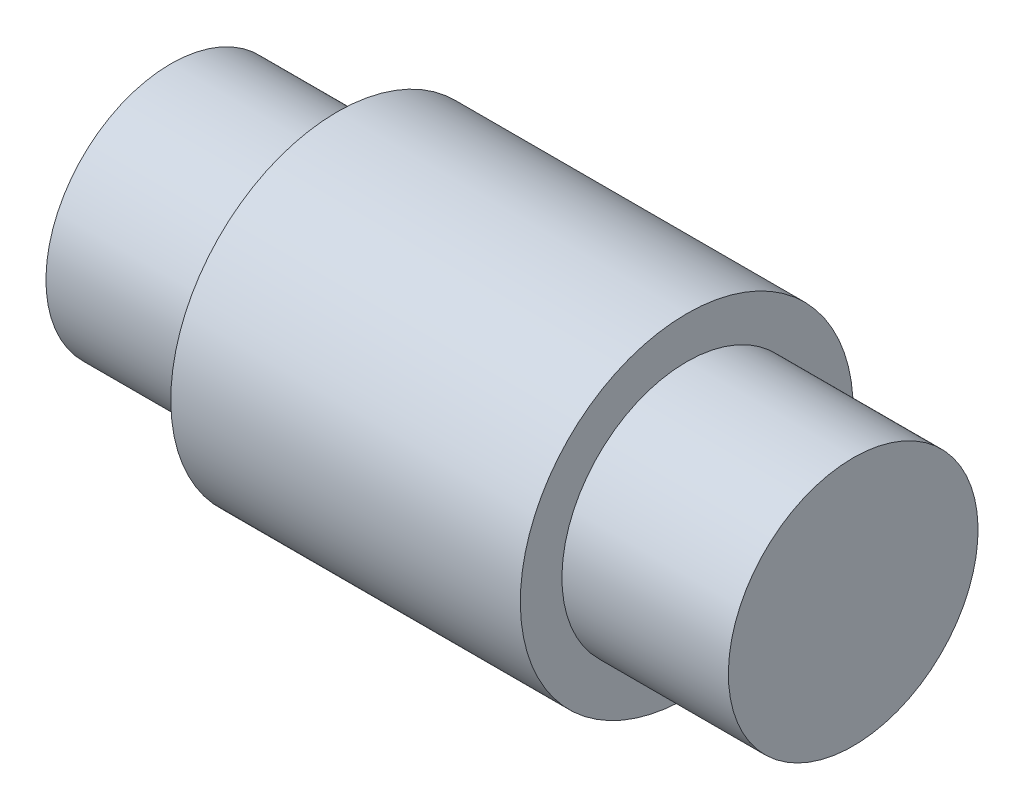
ISO-10303-21;
HEADER;
FILE_DESCRIPTION(('STEP AP214'),'2;1');
FILE_NAME('part.step','',(''),(''),'','','');
FILE_SCHEMA(('AUTOMOTIVE_DESIGN { 1 0 10303 214 1 1 1 1 }'));
ENDSEC;
DATA;
#1=APPLICATION_CONTEXT('core data for automotive mechanical design processes');
#2=APPLICATION_PROTOCOL_DEFINITION('international standard','automotive_design',2000,#1);
#3=PRODUCT_CONTEXT('',#1,'mechanical');
#4=PRODUCT('Part','Part','',(#3));
#5=PRODUCT_RELATED_PRODUCT_CATEGORY('part','',(#4));
#6=PRODUCT_DEFINITION_FORMATION('','',#4);
#7=PRODUCT_DEFINITION_CONTEXT('part definition',#1,'design');
#8=PRODUCT_DEFINITION('design','',#6,#7);
#9=PRODUCT_DEFINITION_SHAPE('','',#8);
#10=(LENGTH_UNIT() NAMED_UNIT(*) SI_UNIT(.MILLI.,.METRE.));
#11=(NAMED_UNIT(*) PLANE_ANGLE_UNIT() SI_UNIT($,.RADIAN.));
#12=(NAMED_UNIT(*) SI_UNIT($,.STERADIAN.) SOLID_ANGLE_UNIT());
#13=UNCERTAINTY_MEASURE_WITH_UNIT(LENGTH_MEASURE(1.E-05),#10,'distance_accuracy_value','');
#14=(GEOMETRIC_REPRESENTATION_CONTEXT(3) GLOBAL_UNCERTAINTY_ASSIGNED_CONTEXT((#13)) GLOBAL_UNIT_ASSIGNED_CONTEXT((#10,
#11,#12)) REPRESENTATION_CONTEXT('',''));
#15=CARTESIAN_POINT('',(0.,0.,0.));
#16=DIRECTION('',(0.,0.,1.));
#17=DIRECTION('',(1.,0.,0.));
#18=AXIS2_PLACEMENT_3D('',#15,#16,#17);
#19=CARTESIAN_POINT('',(0.,-3.,0.));
#20=DIRECTION('',(-1.,0.,0.));
#21=DIRECTION('',(0.,-1.,0.));
#22=AXIS2_PLACEMENT_3D('',#19,#20,#21);
#23=PLANE('',#22);
#24=CARTESIAN_POINT('',(0.,-3.,0.));
#25=DIRECTION('',(1.,0.,0.));
#26=DIRECTION('',(0.,1.,0.));
#27=AXIS2_PLACEMENT_3D('',#24,#25,#26);
#28=CIRCLE('',#27,3.);
#29=CARTESIAN_POINT('',(0.,0.,0.));
#30=VERTEX_POINT('',#29);
#31=EDGE_CURVE('E10',#30,#30,#28,.T.);
#32=ORIENTED_EDGE('',*,*,#31,.F.);
#33=EDGE_LOOP('',(#32));
#34=FACE_BOUND('',#33,.T.);
#35=ADVANCED_FACE('F15',(#34),#23,.T.);
#36=CARTESIAN_POINT('',(16.4,-3.,0.));
#37=DIRECTION('',(1.,0.,0.));
#38=DIRECTION('',(0.,1.,0.));
#39=AXIS2_PLACEMENT_3D('',#36,#37,#38);
#40=CYLINDRICAL_SURFACE('',#39,3.);
#41=ORIENTED_EDGE('',*,*,#31,.T.);
#42=EDGE_LOOP('',(#41));
#43=FACE_BOUND('',#42,.T.);
#44=CARTESIAN_POINT('',(4.,-3.,0.));
#45=DIRECTION('',(1.,0.,0.));
#46=DIRECTION('',(0.,1.,0.));
#47=AXIS2_PLACEMENT_3D('',#44,#45,#46);
#48=CIRCLE('',#47,3.);
#49=CARTESIAN_POINT('',(4.,0.,0.));
#50=VERTEX_POINT('',#49);
#51=EDGE_CURVE('E21',#50,#50,#48,.T.);
#52=ORIENTED_EDGE('',*,*,#51,.F.);
#53=EDGE_LOOP('',(#52));
#54=FACE_BOUND('',#53,.T.);
#55=ADVANCED_FACE('F59',(#43,#54),#40,.T.);
#56=CARTESIAN_POINT('',(4.,0.,0.));
#57=DIRECTION('',(-1.,0.,0.));
#58=DIRECTION('',(0.,-1.,0.));
#59=AXIS2_PLACEMENT_3D('',#56,#57,#58);
#60=PLANE('',#59);
#61=ORIENTED_EDGE('',*,*,#51,.T.);
#62=EDGE_LOOP('',(#61));
#63=FACE_BOUND('',#62,.T.);
#64=CARTESIAN_POINT('',(4.,-3.,0.));
#65=DIRECTION('',(1.,0.,0.));
#66=DIRECTION('',(0.,1.,0.));
#67=AXIS2_PLACEMENT_3D('',#64,#65,#66);
#68=CIRCLE('',#67,4.);
#69=CARTESIAN_POINT('',(4.,1.,0.));
#70=VERTEX_POINT('',#69);
#71=EDGE_CURVE('E25',#70,#70,#68,.T.);
#72=ORIENTED_EDGE('',*,*,#71,.F.);
#73=EDGE_LOOP('',(#72));
#74=FACE_BOUND('',#73,.T.);
#75=ADVANCED_FACE('F65',(#63,#74),#60,.T.);
#76=CARTESIAN_POINT('',(16.4,-3.,0.));
#77=DIRECTION('',(1.,0.,0.));
#78=DIRECTION('',(0.,1.,0.));
#79=AXIS2_PLACEMENT_3D('',#76,#77,#78);
#80=CYLINDRICAL_SURFACE('',#79,4.);
#81=ORIENTED_EDGE('',*,*,#71,.T.);
#82=EDGE_LOOP('',(#81));
#83=FACE_BOUND('',#82,.T.);
#84=CARTESIAN_POINT('',(12.4,-3.,0.));
#85=DIRECTION('',(1.,0.,0.));
#86=DIRECTION('',(0.,1.,0.));
#87=AXIS2_PLACEMENT_3D('',#84,#85,#86);
#88=CIRCLE('',#87,4.);
#89=CARTESIAN_POINT('',(12.4,1.,0.));
#90=VERTEX_POINT('',#89);
#91=EDGE_CURVE('E29',#90,#90,#88,.T.);
#92=ORIENTED_EDGE('',*,*,#91,.F.);
#93=EDGE_LOOP('',(#92));
#94=FACE_BOUND('',#93,.T.);
#95=ADVANCED_FACE('F55',(#83,#94),#80,.T.);
#96=CARTESIAN_POINT('',(12.4,1.,0.));
#97=DIRECTION('',(1.,0.,0.));
#98=DIRECTION('',(0.,1.,0.));
#99=AXIS2_PLACEMENT_3D('',#96,#97,#98);
#100=PLANE('',#99);
#101=ORIENTED_EDGE('',*,*,#91,.T.);
#102=EDGE_LOOP('',(#101));
#103=FACE_BOUND('',#102,.T.);
#104=CARTESIAN_POINT('',(12.4,-3.,0.));
#105=DIRECTION('',(1.,0.,0.));
#106=DIRECTION('',(0.,1.,0.));
#107=AXIS2_PLACEMENT_3D('',#104,#105,#106);
#108=CIRCLE('',#107,3.);
#109=CARTESIAN_POINT('',(12.4,0.,0.));
#110=VERTEX_POINT('',#109);
#111=EDGE_CURVE('E34',#110,#110,#108,.T.);
#112=ORIENTED_EDGE('',*,*,#111,.F.);
#113=EDGE_LOOP('',(#112));
#114=FACE_BOUND('',#113,.T.);
#115=ADVANCED_FACE('F45',(#103,#114),#100,.T.);
#116=CARTESIAN_POINT('',(16.4,-3.,0.));
#117=DIRECTION('',(1.,0.,0.));
#118=DIRECTION('',(0.,1.,0.));
#119=AXIS2_PLACEMENT_3D('',#116,#117,#118);
#120=CYLINDRICAL_SURFACE('',#119,3.);
#121=ORIENTED_EDGE('',*,*,#111,.T.);
#122=EDGE_LOOP('',(#121));
#123=FACE_BOUND('',#122,.T.);
#124=CARTESIAN_POINT('',(16.4,-3.,0.));
#125=DIRECTION('',(1.,0.,0.));
#126=DIRECTION('',(0.,1.,0.));
#127=AXIS2_PLACEMENT_3D('',#124,#125,#126);
#128=CIRCLE('',#127,3.);
#129=CARTESIAN_POINT('',(16.4,0.,0.));
#130=VERTEX_POINT('',#129);
#131=EDGE_CURVE('E37',#130,#130,#128,.T.);
#132=ORIENTED_EDGE('',*,*,#131,.F.);
#133=EDGE_LOOP('',(#132));
#134=FACE_BOUND('',#133,.T.);
#135=ADVANCED_FACE('F43',(#123,#134),#120,.T.);
#136=CARTESIAN_POINT('',(16.4,0.,0.));
#137=DIRECTION('',(1.,0.,0.));
#138=DIRECTION('',(0.,1.,0.));
#139=AXIS2_PLACEMENT_3D('',#136,#137,#138);
#140=PLANE('',#139);
#141=ORIENTED_EDGE('',*,*,#131,.T.);
#142=EDGE_LOOP('',(#141));
#143=FACE_BOUND('',#142,.T.);
#144=ADVANCED_FACE('F41',(#143),#140,.T.);
#145=CLOSED_SHELL('',(#35,#55,#75,#95,#115,#135,#144));
#146=MANIFOLD_SOLID_BREP('B1',#145);
#147=ADVANCED_BREP_SHAPE_REPRESENTATION('',(#18,#146),#14);
#148=SHAPE_DEFINITION_REPRESENTATION(#9,#147);
ENDSEC;
END-ISO-10303-21;
